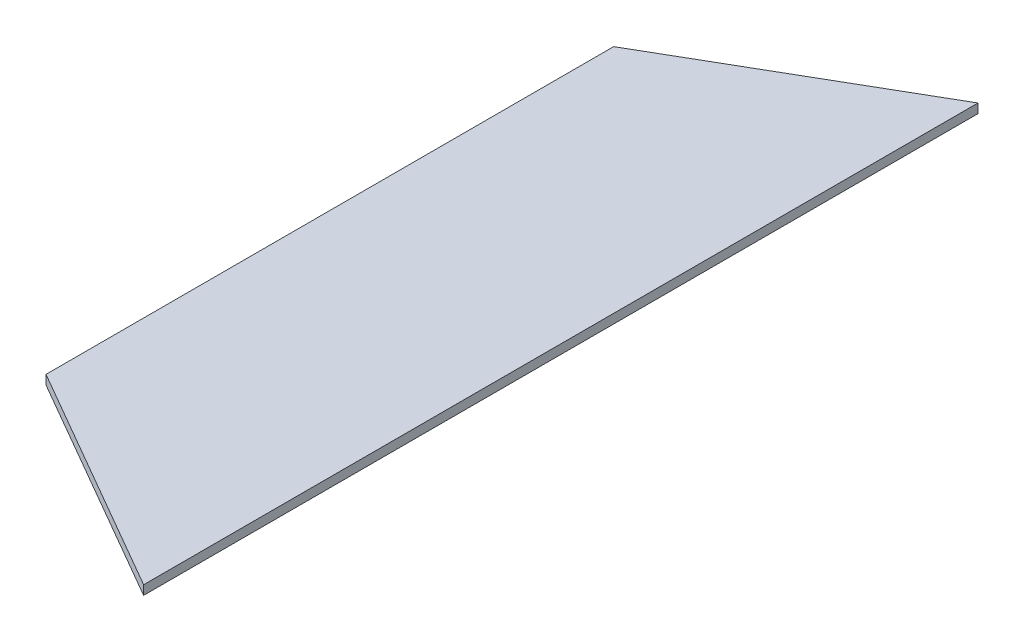
ISO-10303-21;
HEADER;
FILE_DESCRIPTION(('STEP AP214'),'2;1');
FILE_NAME('part.step','',(''),(''),'','','');
FILE_SCHEMA(('AUTOMOTIVE_DESIGN { 1 0 10303 214 1 1 1 1 }'));
ENDSEC;
DATA;
#1=APPLICATION_CONTEXT('core data for automotive mechanical design processes');
#2=APPLICATION_PROTOCOL_DEFINITION('international standard','automotive_design',2000,#1);
#3=PRODUCT_CONTEXT('',#1,'mechanical');
#4=PRODUCT('Part','Part','',(#3));
#5=PRODUCT_RELATED_PRODUCT_CATEGORY('part','',(#4));
#6=PRODUCT_DEFINITION_FORMATION('','',#4);
#7=PRODUCT_DEFINITION_CONTEXT('part definition',#1,'design');
#8=PRODUCT_DEFINITION('design','',#6,#7);
#9=PRODUCT_DEFINITION_SHAPE('','',#8);
#10=(LENGTH_UNIT() NAMED_UNIT(*) SI_UNIT(.MILLI.,.METRE.));
#11=(NAMED_UNIT(*) PLANE_ANGLE_UNIT() SI_UNIT($,.RADIAN.));
#12=(NAMED_UNIT(*) SI_UNIT($,.STERADIAN.) SOLID_ANGLE_UNIT());
#13=UNCERTAINTY_MEASURE_WITH_UNIT(LENGTH_MEASURE(1.E-05),#10,'distance_accuracy_value','');
#14=(GEOMETRIC_REPRESENTATION_CONTEXT(3) GLOBAL_UNCERTAINTY_ASSIGNED_CONTEXT((#13)) GLOBAL_UNIT_ASSIGNED_CONTEXT((#10,
#11,#12)) REPRESENTATION_CONTEXT('',''));
#15=CARTESIAN_POINT('',(0.,0.,0.));
#16=DIRECTION('',(0.,0.,1.));
#17=DIRECTION('',(1.,0.,0.));
#18=AXIS2_PLACEMENT_3D('',#15,#16,#17);
#19=CARTESIAN_POINT('',(-30.,10.,39.8257495273784));
#20=DIRECTION('',(-0.500000000000004,0.,-0.866025403784437));
#21=DIRECTION('',(-0.866025403784436,0.,0.500000000000004));
#22=AXIS2_PLACEMENT_3D('',#19,#20,#21);
#23=PLANE('',#22);
#24=DIRECTION('',(0.,1.,0.));
#25=VECTOR('',#24,1.);
#26=CARTESIAN_POINT('',(-25.,10.,36.9389981814303));
#27=LINE('',#26,#25);
#28=CARTESIAN_POINT('',(-25.,10.,36.9389981814303));
#29=VERTEX_POINT('',#28);
#30=CARTESIAN_POINT('',(-25.,10.2,36.9389981814303));
#31=VERTEX_POINT('',#30);
#32=EDGE_CURVE('E11',#29,#31,#27,.T.);
#33=ORIENTED_EDGE('',*,*,#32,.F.);
#34=DIRECTION('',(-0.866025403784436,0.,0.500000000000004));
#35=VECTOR('',#34,1.);
#36=CARTESIAN_POINT('',(-30.,10.,39.8257495273784));
#37=LINE('',#36,#35);
#38=CARTESIAN_POINT('',(-30.,10.,39.8257495273784));
#39=VERTEX_POINT('',#38);
#40=EDGE_CURVE('E88',#29,#39,#37,.T.);
#41=ORIENTED_EDGE('',*,*,#40,.T.);
#42=DIRECTION('',(0.,1.,0.));
#43=VECTOR('',#42,1.);
#44=CARTESIAN_POINT('',(-30.,10.,39.8257495273784));
#45=LINE('',#44,#43);
#46=CARTESIAN_POINT('',(-30.,10.2,39.8257495273784));
#47=VERTEX_POINT('',#46);
#48=EDGE_CURVE('E43',#39,#47,#45,.T.);
#49=ORIENTED_EDGE('',*,*,#48,.T.);
#50=DIRECTION('',(-0.866025403784436,0.,0.500000000000004));
#51=VECTOR('',#50,1.);
#52=CARTESIAN_POINT('',(-30.,10.2,39.8257495273784));
#53=LINE('',#52,#51);
#54=EDGE_CURVE('E101',#31,#47,#53,.T.);
#55=ORIENTED_EDGE('',*,*,#54,.F.);
#56=EDGE_LOOP('',(#33,#41,#49,#55));
#57=FACE_BOUND('',#56,.T.);
#58=ADVANCED_FACE('F33',(#57),#23,.T.);
#59=CARTESIAN_POINT('',(-30.,10.,0.));
#60=DIRECTION('',(-1.,0.,0.));
#61=DIRECTION('',(0.,0.,1.));
#62=AXIS2_PLACEMENT_3D('',#59,#60,#61);
#63=PLANE('',#62);
#64=ORIENTED_EDGE('',*,*,#48,.F.);
#65=DIRECTION('',(0.,0.,1.));
#66=VECTOR('',#65,1.);
#67=CARTESIAN_POINT('',(-30.,10.,0.));
#68=LINE('',#67,#66);
#69=CARTESIAN_POINT('',(-30.,10.,52.1132486540519));
#70=VERTEX_POINT('',#69);
#71=EDGE_CURVE('E95',#39,#70,#68,.T.);
#72=ORIENTED_EDGE('',*,*,#71,.T.);
#73=DIRECTION('',(0.,1.,0.));
#74=VECTOR('',#73,1.);
#75=CARTESIAN_POINT('',(-30.,10.,52.1132486540519));
#76=LINE('',#75,#74);
#77=CARTESIAN_POINT('',(-30.,10.2,52.1132486540519));
#78=VERTEX_POINT('',#77);
#79=EDGE_CURVE('E51',#70,#78,#76,.T.);
#80=ORIENTED_EDGE('',*,*,#79,.T.);
#81=DIRECTION('',(0.,0.,1.));
#82=VECTOR('',#81,1.);
#83=CARTESIAN_POINT('',(-30.,10.2,0.));
#84=LINE('',#83,#82);
#85=EDGE_CURVE('E82',#47,#78,#84,.T.);
#86=ORIENTED_EDGE('',*,*,#85,.F.);
#87=EDGE_LOOP('',(#64,#72,#80,#86));
#88=FACE_BOUND('',#87,.T.);
#89=ADVANCED_FACE('F105',(#88),#63,.T.);
#90=CARTESIAN_POINT('',(-25.,10.,55.));
#91=DIRECTION('',(-0.499999999999998,0.,0.86602540378444));
#92=DIRECTION('',(0.86602540378444,0.,0.499999999999998));
#93=AXIS2_PLACEMENT_3D('',#90,#91,#92);
#94=PLANE('',#93);
#95=ORIENTED_EDGE('',*,*,#79,.F.);
#96=DIRECTION('',(0.86602540378444,0.,0.499999999999998));
#97=VECTOR('',#96,1.);
#98=CARTESIAN_POINT('',(-25.,10.,55.));
#99=LINE('',#98,#97);
#100=CARTESIAN_POINT('',(-25.,10.,55.));
#101=VERTEX_POINT('',#100);
#102=EDGE_CURVE('E87',#70,#101,#99,.T.);
#103=ORIENTED_EDGE('',*,*,#102,.T.);
#104=DIRECTION('',(0.,1.,0.));
#105=VECTOR('',#104,1.);
#106=CARTESIAN_POINT('',(-25.,10.,55.));
#107=LINE('',#106,#105);
#108=CARTESIAN_POINT('',(-25.,10.2,55.));
#109=VERTEX_POINT('',#108);
#110=EDGE_CURVE('E37',#101,#109,#107,.T.);
#111=ORIENTED_EDGE('',*,*,#110,.T.);
#112=DIRECTION('',(0.86602540378444,0.,0.499999999999998));
#113=VECTOR('',#112,1.);
#114=CARTESIAN_POINT('',(-25.,10.2,55.));
#115=LINE('',#114,#113);
#116=EDGE_CURVE('E97',#78,#109,#115,.T.);
#117=ORIENTED_EDGE('',*,*,#116,.F.);
#118=EDGE_LOOP('',(#95,#103,#111,#117));
#119=FACE_BOUND('',#118,.T.);
#120=ADVANCED_FACE('F90',(#119),#94,.T.);
#121=CARTESIAN_POINT('',(-25.,10.,0.));
#122=DIRECTION('',(-1.,0.,0.));
#123=DIRECTION('',(0.,0.,1.));
#124=AXIS2_PLACEMENT_3D('',#121,#122,#123);
#125=PLANE('',#124);
#126=DIRECTION('',(0.,0.,1.));
#127=VECTOR('',#126,1.);
#128=CARTESIAN_POINT('',(-25.,10.,0.));
#129=LINE('',#128,#127);
#130=EDGE_CURVE('E76',#101,#29,#129,.F.);
#131=ORIENTED_EDGE('',*,*,#130,.T.);
#132=ORIENTED_EDGE('',*,*,#32,.T.);
#133=DIRECTION('',(0.,0.,1.));
#134=VECTOR('',#133,1.);
#135=CARTESIAN_POINT('',(-25.,10.2,0.));
#136=LINE('',#135,#134);
#137=EDGE_CURVE('E78',#109,#31,#136,.F.);
#138=ORIENTED_EDGE('',*,*,#137,.F.);
#139=ORIENTED_EDGE('',*,*,#110,.F.);
#140=EDGE_LOOP('',(#131,#132,#138,#139));
#141=FACE_BOUND('',#140,.T.);
#142=ADVANCED_FACE('F35',(#141),#125,.F.);
#143=CARTESIAN_POINT('',(0.,10.2,0.));
#144=DIRECTION('',(0.,1.,0.));
#145=DIRECTION('',(0.,0.,1.));
#146=AXIS2_PLACEMENT_3D('',#143,#144,#145);
#147=PLANE('',#146);
#148=ORIENTED_EDGE('',*,*,#116,.T.);
#149=ORIENTED_EDGE('',*,*,#137,.T.);
#150=ORIENTED_EDGE('',*,*,#54,.T.);
#151=ORIENTED_EDGE('',*,*,#85,.T.);
#152=EDGE_LOOP('',(#148,#149,#150,#151));
#153=FACE_BOUND('',#152,.T.);
#154=ADVANCED_FACE('F104',(#153),#147,.T.);
#155=CARTESIAN_POINT('',(0.,10.,0.));
#156=DIRECTION('',(0.,1.,0.));
#157=DIRECTION('',(0.,0.,1.));
#158=AXIS2_PLACEMENT_3D('',#155,#156,#157);
#159=PLANE('',#158);
#160=ORIENTED_EDGE('',*,*,#102,.F.);
#161=ORIENTED_EDGE('',*,*,#71,.F.);
#162=ORIENTED_EDGE('',*,*,#40,.F.);
#163=ORIENTED_EDGE('',*,*,#130,.F.);
#164=EDGE_LOOP('',(#160,#161,#162,#163));
#165=FACE_BOUND('',#164,.T.);
#166=ADVANCED_FACE('F85',(#165),#159,.F.);
#167=CLOSED_SHELL('',(#58,#89,#120,#142,#154,#166));
#168=MANIFOLD_SOLID_BREP('B2',#167);
#169=ADVANCED_BREP_SHAPE_REPRESENTATION('',(#18,#168),#14);
#170=SHAPE_DEFINITION_REPRESENTATION(#9,#169);
ENDSEC;
END-ISO-10303-21;
